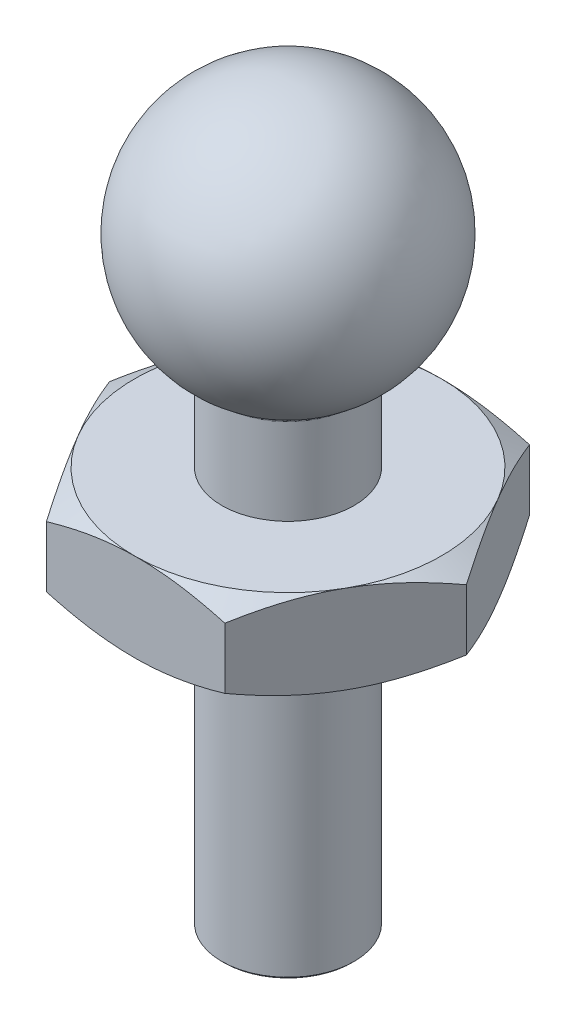
ISO-10303-21;
HEADER;
FILE_DESCRIPTION(('STEP AP214'),'2;1');
FILE_NAME('part.step','',(''),(''),'','','');
FILE_SCHEMA(('AUTOMOTIVE_DESIGN { 1 0 10303 214 1 1 1 1 }'));
ENDSEC;
DATA;
#1=APPLICATION_CONTEXT('core data for automotive mechanical design processes');
#2=APPLICATION_PROTOCOL_DEFINITION('international standard','automotive_design',2000,#1);
#3=PRODUCT_CONTEXT('',#1,'mechanical');
#4=PRODUCT('Part','Part','',(#3));
#5=PRODUCT_RELATED_PRODUCT_CATEGORY('part','',(#4));
#6=PRODUCT_DEFINITION_FORMATION('','',#4);
#7=PRODUCT_DEFINITION_CONTEXT('part definition',#1,'design');
#8=PRODUCT_DEFINITION('design','',#6,#7);
#9=PRODUCT_DEFINITION_SHAPE('','',#8);
#10=(LENGTH_UNIT() NAMED_UNIT(*) SI_UNIT(.MILLI.,.METRE.));
#11=(NAMED_UNIT(*) PLANE_ANGLE_UNIT() SI_UNIT($,.RADIAN.));
#12=(NAMED_UNIT(*) SI_UNIT($,.STERADIAN.) SOLID_ANGLE_UNIT());
#13=UNCERTAINTY_MEASURE_WITH_UNIT(LENGTH_MEASURE(1.E-05),#10,'distance_accuracy_value','');
#14=(GEOMETRIC_REPRESENTATION_CONTEXT(3) GLOBAL_UNCERTAINTY_ASSIGNED_CONTEXT((#13)) GLOBAL_UNIT_ASSIGNED_CONTEXT((#10,
#11,#12)) REPRESENTATION_CONTEXT('',''));
#15=CARTESIAN_POINT('',(0.,0.,0.));
#16=DIRECTION('',(0.,0.,1.));
#17=DIRECTION('',(1.,0.,0.));
#18=AXIS2_PLACEMENT_3D('',#15,#16,#17);
#19=CARTESIAN_POINT('',(2.03230647050247,9.,3.46410161513776));
#20=DIRECTION('',(0.0069662544333495,0.,0.999975735355198));
#21=DIRECTION('',(0.999975735355199,0.,-0.0069662544333495));
#22=AXIS2_PLACEMENT_3D('',#19,#20,#21);
#23=PLANE('',#22);
#24=DIRECTION('',(0.,-1.,0.));
#25=VECTOR('',#24,1.);
#26=CARTESIAN_POINT('',(2.03230647050247,9.,3.46410161513776));
#27=LINE('',#26,#25);
#28=CARTESIAN_POINT('',(2.03230647050247,8.68934192813876,3.46410161513776));
#29=VERTEX_POINT('',#28);
#30=CARTESIAN_POINT('',(2.03230647050247,7.31065807186124,3.46410161513776));
#31=VERTEX_POINT('',#30);
#32=EDGE_CURVE('E342',#29,#31,#27,.T.);
#33=ORIENTED_EDGE('',*,*,#32,.F.);
#34=CARTESIAN_POINT('',(2.03250647050247,8.68928418955454,3.46410022185306));
#35=CARTESIAN_POINT('',(1.85601748331803,8.74025194472752,3.46532971887578));
#36=CARTESIAN_POINT('',(1.67800505315194,8.78660517486892,3.46656982884745));
#37=CARTESIAN_POINT('',(1.31889775153608,8.86751500820949,3.46907152238208));
#38=CARTESIAN_POINT('',(1.13779649948355,8.90204298882506,3.47033315039503));
#39=CARTESIAN_POINT('',(0.777838393760421,8.95579055431224,3.47284077099137));
#40=CARTESIAN_POINT('',(0.599036922487538,8.97536786216779,3.47408637775752));
#41=CARTESIAN_POINT('',(0.240592702163102,8.99873864309493,3.47658345198708));
#42=CARTESIAN_POINT('',(0.0609512558694038,9.00255146967248,3.47783491037493));
#43=CARTESIAN_POINT('',(-0.274715876240262,8.99461743225737,3.48017330976255));
#44=CARTESIAN_POINT('',(-0.430791822340754,8.98481864294247,3.48126060089675));
#45=CARTESIAN_POINT('',(-0.741926885815265,8.95376286530669,3.48342809950563));
#46=CARTESIAN_POINT('',(-0.896984927116478,8.93249526933151,3.48450829948394));
#47=CARTESIAN_POINT('',(-1.2087614384966,8.87932817360267,3.48668026669057));
#48=CARTESIAN_POINT('',(-1.36544045034433,8.84720331090522,3.48777175903614));
#49=CARTESIAN_POINT('',(-1.67646170630289,8.7742926009489,3.48993846481367));
#50=CARTESIAN_POINT('',(-1.8308079347421,8.73352388407218,3.49101370600215));
#51=CARTESIAN_POINT('',(-1.98404676474877,8.68928418955454,3.4920812325842));
#52=B_SPLINE_CURVE_WITH_KNOTS('',3,(#34,#35,#36,#37,#38,#39,#40,#41,#42,#43,#44,#45,#46,#47,#48,
#49,#50,#51),.UNSPECIFIED.,.F.,.F.,(4,2,2,2,2,2,2,2,4),(0.,0.551332297066217,1.10398979547317,
1.6429693972962,2.1812871157581,2.6500021487578,3.11915144804698,3.59870696123175,
4.07732082967591),.UNSPECIFIED.);
#53=CARTESIAN_POINT('',(0.0242298528768522,9.,3.47809072721863));
#54=VERTEX_POINT('',#53);
#55=EDGE_CURVE('E415',#29,#54,#52,.T.);
#56=ORIENTED_EDGE('',*,*,#55,.T.);
#57=CARTESIAN_POINT('',(-1.98384676474877,8.68934192813876,3.49207983929951));
#58=VERTEX_POINT('',#57);
#59=EDGE_CURVE('E72',#54,#58,#52,.T.);
#60=ORIENTED_EDGE('',*,*,#59,.T.);
#61=DIRECTION('',(0.,-1.,0.));
#62=VECTOR('',#61,1.);
#63=CARTESIAN_POINT('',(-1.98384676474877,9.,3.49207983929951));
#64=LINE('',#63,#62);
#65=CARTESIAN_POINT('',(-1.98384676474877,7.31065807186124,3.49207983929951));
#66=VERTEX_POINT('',#65);
#67=EDGE_CURVE('E389',#58,#66,#64,.T.);
#68=ORIENTED_EDGE('',*,*,#67,.T.);
#69=CARTESIAN_POINT('',(-1.98404676474877,7.31071581044546,3.4920812325842));
#70=CARTESIAN_POINT('',(-1.80755777756433,7.25974805527248,3.49085173556148));
#71=CARTESIAN_POINT('',(-1.62954534739823,7.21339482513108,3.48961162558982));
#72=CARTESIAN_POINT('',(-1.27043804578238,7.13248499179051,3.48710993205518));
#73=CARTESIAN_POINT('',(-1.08933679372985,7.09795701117494,3.48584830404223));
#74=CARTESIAN_POINT('',(-0.729378688006716,7.04420944568776,3.4833406834459));
#75=CARTESIAN_POINT('',(-0.550577216733833,7.02463213783221,3.48209507667975));
#76=CARTESIAN_POINT('',(-0.192132996409398,7.00126135690507,3.47959800245018));
#77=CARTESIAN_POINT('',(-0.012491550115699,6.99744853032752,3.47834654406233));
#78=CARTESIAN_POINT('',(0.323175581993966,7.00538256774263,3.47600814467471));
#79=CARTESIAN_POINT('',(0.479251528094459,7.01518135705753,3.47492085354052));
#80=CARTESIAN_POINT('',(0.79038659156897,7.04623713469332,3.47275335493163));
#81=CARTESIAN_POINT('',(0.945444632870183,7.06750473066849,3.47167315495332));
#82=CARTESIAN_POINT('',(1.2572211442503,7.12067182639733,3.4695011877467));
#83=CARTESIAN_POINT('',(1.41390015609803,7.15279668909478,3.46840969540112));
#84=CARTESIAN_POINT('',(1.7249214120566,7.22570739905111,3.46624298962359));
#85=CARTESIAN_POINT('',(1.87926764049581,7.26647611592782,3.46516774843511));
#86=CARTESIAN_POINT('',(2.03250647050247,7.31071581044546,3.46410022185306));
#87=B_SPLINE_CURVE_WITH_KNOTS('',3,(#69,#70,#71,#72,#73,#74,#75,#76,#77,#78,#79,#80,#81,#82,#83,
#84,#85,#86),.UNSPECIFIED.,.F.,.F.,(4,2,2,2,2,2,2,2,4),(0.,0.551332297066217,1.10398979547317,
1.6429693972962,2.1812871157581,2.6500021487578,3.11915144804698,3.59870696123175,
4.07732082967591),.UNSPECIFIED.);
#88=CARTESIAN_POINT('',(0.0242298528768522,7.,3.47809072721863));
#89=VERTEX_POINT('',#88);
#90=EDGE_CURVE('E393',#66,#89,#87,.T.);
#91=ORIENTED_EDGE('',*,*,#90,.T.);
#92=EDGE_CURVE('E272',#89,#31,#87,.T.);
#93=ORIENTED_EDGE('',*,*,#92,.T.);
#94=EDGE_LOOP('',(#33,#56,#60,#68,#91,#93));
#95=FACE_BOUND('',#94,.T.);
#96=ADVANCED_FACE('F49',(#95),#23,.T.);
#97=CARTESIAN_POINT('',(4.01615323525124,9.,-0.0279782241617523));
#98=DIRECTION('',(0.869487517202301,0.,0.493954914369092));
#99=DIRECTION('',(0.493954914369093,0.,-0.869487517202302));
#100=AXIS2_PLACEMENT_3D('',#97,#98,#99);
#101=PLANE('',#100);
#102=DIRECTION('',(0.,-1.,0.));
#103=VECTOR('',#102,1.);
#104=CARTESIAN_POINT('',(4.01615323525124,9.,-0.0279782241617523));
#105=LINE('',#104,#103);
#106=CARTESIAN_POINT('',(4.01615323525124,8.68934192813876,-0.0279782241617523));
#107=VERTEX_POINT('',#106);
#108=CARTESIAN_POINT('',(4.01615323525124,7.31065807186124,-0.027978224161752));
#109=VERTEX_POINT('',#108);
#110=EDGE_CURVE('E406',#107,#109,#105,.T.);
#111=ORIENTED_EDGE('',*,*,#110,.F.);
#112=CARTESIAN_POINT('',(4.01626685503406,8.68927552407237,-0.0281782241617523));
#113=CARTESIAN_POINT('',(3.9290868868754,8.74024399092435,0.125280911194497));
#114=CARTESIAN_POINT('',(3.84115438670236,8.78659797699318,0.280064696177183));
#115=CARTESIAN_POINT('',(3.66376673763542,8.86750937925603,0.592312518970017));
#116=CARTESIAN_POINT('',(3.57430843677446,8.90203817187993,0.74978210505173));
#117=CARTESIAN_POINT('',(3.39650050450891,8.95578734264458,1.06276973422011));
#118=CARTESIAN_POINT('',(3.30817823127798,8.97536544866704,1.21823961989441));
#119=CARTESIAN_POINT('',(3.13111809078578,8.99873777230102,1.52991094347803));
#120=CARTESIAN_POINT('',(3.04238086710546,9.00255134407133,1.68611124851959));
#121=CARTESIAN_POINT('',(2.8765699084233,8.99461848445263,1.97798112286557));
#122=CARTESIAN_POINT('',(2.79947135422721,8.98481983937969,2.11369438032647));
#123=CARTESIAN_POINT('',(2.64577654324323,8.95376367118281,2.3842367227992));
#124=CARTESIAN_POINT('',(2.56918081806996,8.93249553885329,2.51906487203279));
#125=CARTESIAN_POINT('',(2.41516910839241,8.87932676878832,2.79016503759882));
#126=CARTESIAN_POINT('',(2.3377726168893,8.84720074656483,2.9264027412426));
#127=CARTESIAN_POINT('',(2.18413399600553,8.77428727696288,3.19684617470704));
#128=CARTESIAN_POINT('',(2.10788989822988,8.73351696215556,3.33105536940847));
#129=CARTESIAN_POINT('',(2.03219285071964,8.68927552407237,3.46430161513776));
#130=B_SPLINE_CURVE_WITH_KNOTS('',3,(#112,#113,#114,#115,#116,#117,#118,#119,#120,#121,#122,
#123,#124,#125,#126,#127,#128,#129),.UNSPECIFIED.,.F.,.F.,(4,2,2,2,2,2,2,2,4),(0.,
0.551334352338487,1.10399396230123,1.64297542301435,2.18129497793636,2.65002329393806,
3.11918592631203,3.59875547814022,4.07738328565858),.UNSPECIFIED.);
#131=CARTESIAN_POINT('',(3.02422985287685,9.,1.718061695488));
#132=VERTEX_POINT('',#131);
#133=EDGE_CURVE('E145',#107,#132,#130,.T.);
#134=ORIENTED_EDGE('',*,*,#133,.T.);
#135=EDGE_CURVE('E64',#132,#29,#130,.T.);
#136=ORIENTED_EDGE('',*,*,#135,.T.);
#137=ORIENTED_EDGE('',*,*,#32,.T.);
#138=CARTESIAN_POINT('',(2.03219285071964,7.31072447592763,3.46430161513776));
#139=CARTESIAN_POINT('',(2.11937281887831,7.25975600907565,3.31084247978151));
#140=CARTESIAN_POINT('',(2.20730531905135,7.21340202300682,3.15605869479882));
#141=CARTESIAN_POINT('',(2.38469296811829,7.13249062074397,2.84381087200599));
#142=CARTESIAN_POINT('',(2.47415126897925,7.09796182812007,2.68634128592427));
#143=CARTESIAN_POINT('',(2.6519592012448,7.04421265735542,2.3733536567559));
#144=CARTESIAN_POINT('',(2.74028147447572,7.02463455133296,2.2178837710816));
#145=CARTESIAN_POINT('',(2.91734161496792,7.00126222769899,1.90621244749797));
#146=CARTESIAN_POINT('',(3.00607883864824,6.99744865592868,1.75001214245642));
#147=CARTESIAN_POINT('',(3.17188979733041,7.00538151554737,1.45814226811043));
#148=CARTESIAN_POINT('',(3.2489883515265,7.01518016062031,1.32242901064954));
#149=CARTESIAN_POINT('',(3.40268316251048,7.04623632881719,1.0518866681768));
#150=CARTESIAN_POINT('',(3.47927888768375,7.06750446114671,0.917058518943212));
#151=CARTESIAN_POINT('',(3.6332905973613,7.12067323121169,0.645958353377186));
#152=CARTESIAN_POINT('',(3.71068708886441,7.15279925343517,0.509720649733405));
#153=CARTESIAN_POINT('',(3.86432570974817,7.22571272303712,0.239277216268965));
#154=CARTESIAN_POINT('',(3.94056980752383,7.26648303784444,0.105068021567539));
#155=CARTESIAN_POINT('',(4.01626685503406,7.31072447592763,-0.0281782241617522));
#156=B_SPLINE_CURVE_WITH_KNOTS('',3,(#138,#139,#140,#141,#142,#143,#144,#145,#146,#147,#148,
#149,#150,#151,#152,#153,#154,#155),.UNSPECIFIED.,.F.,.F.,(4,2,2,2,2,2,2,2,4),(0.,
0.551334352338486,1.10399396230123,1.64297542301435,2.18129497793635,2.65002329393806,
3.11918592631202,3.59875547814022,4.07738328565858),.UNSPECIFIED.);
#157=CARTESIAN_POINT('',(3.02422985287685,7.,1.718061695488));
#158=VERTEX_POINT('',#157);
#159=EDGE_CURVE('E271',#31,#158,#156,.T.);
#160=ORIENTED_EDGE('',*,*,#159,.T.);
#161=EDGE_CURVE('E264',#158,#109,#156,.T.);
#162=ORIENTED_EDGE('',*,*,#161,.T.);
#163=EDGE_LOOP('',(#111,#134,#136,#137,#160,#162));
#164=FACE_BOUND('',#163,.T.);
#165=ADVANCED_FACE('F278',(#164),#101,.T.);
#166=CARTESIAN_POINT('',(1.98384676474877,9.,-3.49207983929951));
#167=DIRECTION('',(0.862521262768952,0.,-0.506020820986106));
#168=DIRECTION('',(-0.506020820986106,0.,-0.862521262768952));
#169=AXIS2_PLACEMENT_3D('',#166,#167,#168);
#170=PLANE('',#169);
#171=DIRECTION('',(0.,-1.,0.));
#172=VECTOR('',#171,1.);
#173=CARTESIAN_POINT('',(1.98384676474877,9.,-3.49207983929951));
#174=LINE('',#173,#172);
#175=CARTESIAN_POINT('',(1.98384676474877,8.68934192813876,-3.49207983929951));
#176=VERTEX_POINT('',#175);
#177=CARTESIAN_POINT('',(1.98384676474877,7.31065807186124,-3.49207983929951));
#178=VERTEX_POINT('',#177);
#179=EDGE_CURVE('E171',#176,#178,#174,.T.);
#180=ORIENTED_EDGE('',*,*,#179,.F.);
#181=CARTESIAN_POINT('',(1.98372942947998,8.6892749877289,-3.49227983929951));
#182=CARTESIAN_POINT('',(2.07303897092758,8.74024349862941,-3.34005017745163));
#183=CARTESIAN_POINT('',(2.16311942669748,8.78659753148546,-3.18650647877527));
#184=CARTESIAN_POINT('',(2.34484018248356,8.86750903085492,-2.87676029986015));
#185=CARTESIAN_POINT('',(2.43648371147052,8.90203787373715,-2.72055231578472));
#186=CARTESIAN_POINT('',(2.61863501766835,8.95578714385864,-2.41007225622788));
#187=CARTESIAN_POINT('',(2.70911476835368,8.97536529928277,-2.25584795244518));
#188=CARTESIAN_POINT('',(2.89050001747252,8.99873771840097,-1.9466736504614));
#189=CARTESIAN_POINT('',(2.98140485660032,9.00255133629425,-1.79172477605831));
#190=CARTESIAN_POINT('',(3.15126626193074,8.99461854957516,-1.5021930656125));
#191=CARTESIAN_POINT('',(3.23024825309996,8.98481991343071,-1.36756689227338));
#192=CARTESIAN_POINT('',(3.38769766721966,8.95376372106143,-1.09919163604556));
#193=CARTESIAN_POINT('',(3.46616454556526,8.932495555535,-0.965443481445333));
#194=CARTESIAN_POINT('',(3.62393860213959,8.8793266818386,-0.696514866524953));
#195=CARTESIAN_POINT('',(3.70322581108577,8.84720058784712,-0.561368444193122));
#196=CARTESIAN_POINT('',(3.86061766425667,8.77428694743888,-0.293091301600526));
#197=CARTESIAN_POINT('',(3.93872432497569,8.73351653372877,-0.159957144190263));
#198=CARTESIAN_POINT('',(4.01627057052002,8.6892749877289,-0.0277782241617519));
#199=B_SPLINE_CURVE_WITH_KNOTS('',3,(#181,#182,#183,#184,#185,#186,#187,#188,#189,#190,#191,
#192,#193,#194,#195,#196,#197,#198),.UNSPECIFIED.,.F.,.F.,(4,2,2,2,2,2,2,2,4),(0.,
0.551334479547965,1.10399422020381,1.64297579597154,2.18129546455986,2.65002460269731,
3.11918806030695,3.59875848104145,4.07738715130318),.UNSPECIFIED.);
#200=CARTESIAN_POINT('',(3.,9.,-1.76002903173063));
#201=VERTEX_POINT('',#200);
#202=EDGE_CURVE('E149',#176,#201,#199,.T.);
#203=ORIENTED_EDGE('',*,*,#202,.T.);
#204=EDGE_CURVE('E138',#201,#107,#199,.T.);
#205=ORIENTED_EDGE('',*,*,#204,.T.);
#206=ORIENTED_EDGE('',*,*,#110,.T.);
#207=CARTESIAN_POINT('',(4.01627057052002,7.3107250122711,-0.0277782241617522));
#208=CARTESIAN_POINT('',(3.92696102907242,7.25975650137059,-0.180007886009625));
#209=CARTESIAN_POINT('',(3.83688057330252,7.21340246851454,-0.333551584685985));
#210=CARTESIAN_POINT('',(3.65515981751644,7.13249096914508,-0.643297763601108));
#211=CARTESIAN_POINT('',(3.56351628852948,7.09796212626285,-0.799505747676537));
#212=CARTESIAN_POINT('',(3.38136498233165,7.04421285614136,-1.10998580723338));
#213=CARTESIAN_POINT('',(3.29088523164632,7.02463470071723,-1.26421011101608));
#214=CARTESIAN_POINT('',(3.10949998252748,7.00126228159903,-1.57338441299986));
#215=CARTESIAN_POINT('',(3.01859514339968,6.99744866370575,-1.72833328740295));
#216=CARTESIAN_POINT('',(2.84873373806926,7.00538145042484,-2.01786499784876));
#217=CARTESIAN_POINT('',(2.76975174690004,7.01518008656929,-2.15249117118788));
#218=CARTESIAN_POINT('',(2.61230233278034,7.04623627893857,-2.4208664274157));
#219=CARTESIAN_POINT('',(2.53383545443474,7.067504444465,-2.55461458201593));
#220=CARTESIAN_POINT('',(2.37606139786042,7.1206733181614,-2.82354319693631));
#221=CARTESIAN_POINT('',(2.29677418891423,7.15279941215288,-2.95868961926814));
#222=CARTESIAN_POINT('',(2.13938233574333,7.22571305256112,-3.22696676186073));
#223=CARTESIAN_POINT('',(2.06127567502431,7.26648346627123,-3.360100919271));
#224=CARTESIAN_POINT('',(1.98372942947998,7.3107250122711,-3.49227983929951));
#225=B_SPLINE_CURVE_WITH_KNOTS('',3,(#207,#208,#209,#210,#211,#212,#213,#214,#215,#216,#217,
#218,#219,#220,#221,#222,#223,#224),.UNSPECIFIED.,.F.,.F.,(4,2,2,2,2,2,2,2,4),(0.,
0.551334479547965,1.10399422020381,1.64297579597154,2.18129546455986,2.65002460269731,
3.11918806030695,3.59875848104145,4.07738715130318),.UNSPECIFIED.);
#226=CARTESIAN_POINT('',(3.,7.,-1.76002903173063));
#227=VERTEX_POINT('',#226);
#228=EDGE_CURVE('E263',#109,#227,#225,.T.);
#229=ORIENTED_EDGE('',*,*,#228,.T.);
#230=EDGE_CURVE('E257',#227,#178,#225,.T.);
#231=ORIENTED_EDGE('',*,*,#230,.T.);
#232=EDGE_LOOP('',(#180,#203,#205,#206,#229,#231));
#233=FACE_BOUND('',#232,.T.);
#234=ADVANCED_FACE('F169',(#233),#170,.T.);
#235=CARTESIAN_POINT('',(-2.03230647050247,9.,-3.46410161513776));
#236=DIRECTION('',(-0.00696625443334983,0.,-0.999975735355198));
#237=DIRECTION('',(-0.999975735355199,0.,0.00696625443334983));
#238=AXIS2_PLACEMENT_3D('',#235,#236,#237);
#239=PLANE('',#238);
#240=DIRECTION('',(0.,-1.,0.));
#241=VECTOR('',#240,1.);
#242=CARTESIAN_POINT('',(-2.03230647050247,9.,-3.46410161513776));
#243=LINE('',#242,#241);
#244=CARTESIAN_POINT('',(-2.03230647050247,8.68934192813876,-3.46410161513776));
#245=VERTEX_POINT('',#244);
#246=CARTESIAN_POINT('',(-2.03230647050247,7.31065807186124,-3.46410161513776));
#247=VERTEX_POINT('',#246);
#248=EDGE_CURVE('E378',#245,#247,#243,.T.);
#249=ORIENTED_EDGE('',*,*,#248,.F.);
#250=CARTESIAN_POINT('',(-2.03250647050247,8.68928418955454,-3.46410022185306));
#251=CARTESIAN_POINT('',(-1.85601748331803,8.74025194472753,-3.46532971887578));
#252=CARTESIAN_POINT('',(-1.67800505315194,8.78660517486892,-3.46656982884744));
#253=CARTESIAN_POINT('',(-1.31889775153608,8.86751500820949,-3.46907152238208));
#254=CARTESIAN_POINT('',(-1.13779649948355,8.90204298882506,-3.47033315039503));
#255=CARTESIAN_POINT('',(-0.777838393760421,8.95579055431224,-3.47284077099137));
#256=CARTESIAN_POINT('',(-0.599036922487538,8.97536786216779,-3.47408637775752));
#257=CARTESIAN_POINT('',(-0.240592702163102,8.99873864309493,-3.47658345198708));
#258=CARTESIAN_POINT('',(-0.0609512558694041,9.00255146967248,-3.47783491037493));
#259=CARTESIAN_POINT('',(0.274715876240261,8.99461743225737,-3.48017330976255));
#260=CARTESIAN_POINT('',(0.430791822340754,8.98481864294247,-3.48126060089675));
#261=CARTESIAN_POINT('',(0.741926885815265,8.95376286530669,-3.48342809950563));
#262=CARTESIAN_POINT('',(0.896984927116478,8.93249526933151,-3.48450829948394));
#263=CARTESIAN_POINT('',(1.2087614384966,8.87932817360267,-3.48668026669057));
#264=CARTESIAN_POINT('',(1.36544045034433,8.84720331090522,-3.48777175903614));
#265=CARTESIAN_POINT('',(1.67646170630289,8.7742926009489,-3.48993846481367));
#266=CARTESIAN_POINT('',(1.8308079347421,8.73352388407218,-3.49101370600215));
#267=CARTESIAN_POINT('',(1.98404676474877,8.68928418955454,-3.4920812325842));
#268=B_SPLINE_CURVE_WITH_KNOTS('',3,(#250,#251,#252,#253,#254,#255,#256,#257,#258,#259,#260,
#261,#262,#263,#264,#265,#266,#267),.UNSPECIFIED.,.F.,.F.,(4,2,2,2,2,2,2,2,4),(0.,
0.551332297066216,1.10398979547317,1.6429693972962,2.1812871157581,2.6500021487578,
3.11915144804698,3.59870696123175,4.07732082967591),.UNSPECIFIED.);
#269=CARTESIAN_POINT('',(-0.0242298528768534,9.,-3.47809072721863));
#270=VERTEX_POINT('',#269);
#271=EDGE_CURVE('E228',#245,#270,#268,.T.);
#272=ORIENTED_EDGE('',*,*,#271,.T.);
#273=EDGE_CURVE('E150',#270,#176,#268,.T.);
#274=ORIENTED_EDGE('',*,*,#273,.T.);
#275=ORIENTED_EDGE('',*,*,#179,.T.);
#276=CARTESIAN_POINT('',(1.98404676474877,7.31071581044546,-3.4920812325842));
#277=CARTESIAN_POINT('',(1.80755777756433,7.25974805527248,-3.49085173556148));
#278=CARTESIAN_POINT('',(1.62954534739823,7.21339482513108,-3.48961162558982));
#279=CARTESIAN_POINT('',(1.27043804578238,7.13248499179051,-3.48710993205518));
#280=CARTESIAN_POINT('',(1.08933679372985,7.09795701117494,-3.48584830404223));
#281=CARTESIAN_POINT('',(0.729378688006715,7.04420944568776,-3.4833406834459));
#282=CARTESIAN_POINT('',(0.550577216733832,7.02463213783221,-3.48209507667975));
#283=CARTESIAN_POINT('',(0.192132996409397,7.00126135690507,-3.47959800245018));
#284=CARTESIAN_POINT('',(0.0124915501156984,6.99744853032752,-3.47834654406233));
#285=CARTESIAN_POINT('',(-0.323175581993967,7.00538256774263,-3.47600814467471));
#286=CARTESIAN_POINT('',(-0.479251528094459,7.01518135705753,-3.47492085354052));
#287=CARTESIAN_POINT('',(-0.79038659156897,7.04623713469331,-3.47275335493163));
#288=CARTESIAN_POINT('',(-0.945444632870183,7.06750473066849,-3.47167315495332));
#289=CARTESIAN_POINT('',(-1.2572211442503,7.12067182639733,-3.4695011877467));
#290=CARTESIAN_POINT('',(-1.41390015609804,7.15279668909478,-3.46840969540112));
#291=CARTESIAN_POINT('',(-1.7249214120566,7.22570739905111,-3.46624298962359));
#292=CARTESIAN_POINT('',(-1.87926764049581,7.26647611592782,-3.46516774843511));
#293=CARTESIAN_POINT('',(-2.03250647050247,7.31071581044546,-3.46410022185306));
#294=B_SPLINE_CURVE_WITH_KNOTS('',3,(#276,#277,#278,#279,#280,#281,#282,#283,#284,#285,#286,
#287,#288,#289,#290,#291,#292,#293),.UNSPECIFIED.,.F.,.F.,(4,2,2,2,2,2,2,2,4),(0.,
0.551332297066216,1.10398979547317,1.6429693972962,2.1812871157581,2.6500021487578,
3.11915144804698,3.59870696123175,4.07732082967591),.UNSPECIFIED.);
#295=CARTESIAN_POINT('',(-0.0242298528768534,7.,-3.47809072721863));
#296=VERTEX_POINT('',#295);
#297=EDGE_CURVE('E250',#178,#296,#294,.T.);
#298=ORIENTED_EDGE('',*,*,#297,.T.);
#299=EDGE_CURVE('E242',#296,#247,#294,.T.);
#300=ORIENTED_EDGE('',*,*,#299,.T.);
#301=EDGE_LOOP('',(#249,#272,#274,#275,#298,#300));
#302=FACE_BOUND('',#301,.T.);
#303=ADVANCED_FACE('F234',(#302),#239,.T.);
#304=CARTESIAN_POINT('',(-4.01615323525124,9.,0.0279782241617515));
#305=DIRECTION('',(-0.869487517202301,0.,-0.493954914369093));
#306=DIRECTION('',(-0.493954914369093,0.,0.869487517202301));
#307=AXIS2_PLACEMENT_3D('',#304,#305,#306);
#308=PLANE('',#307);
#309=DIRECTION('',(0.,-1.,0.));
#310=VECTOR('',#309,1.);
#311=CARTESIAN_POINT('',(-4.01615323525124,9.,0.0279782241617515));
#312=LINE('',#311,#310);
#313=CARTESIAN_POINT('',(-4.01615323525124,8.68934192813876,0.0279782241617515));
#314=VERTEX_POINT('',#313);
#315=CARTESIAN_POINT('',(-4.01615323525124,7.31065807186124,0.0279782241617513));
#316=VERTEX_POINT('',#315);
#317=EDGE_CURVE('E395',#314,#316,#312,.T.);
#318=ORIENTED_EDGE('',*,*,#317,.F.);
#319=CARTESIAN_POINT('',(-4.01626685503406,8.68927552407237,0.0281782241617515));
#320=CARTESIAN_POINT('',(-3.9290868868754,8.74024399092435,-0.125280911194497));
#321=CARTESIAN_POINT('',(-3.84115438670236,8.78659797699318,-0.280064696177184));
#322=CARTESIAN_POINT('',(-3.66376673763542,8.86750937925603,-0.592312518970018));
#323=CARTESIAN_POINT('',(-3.57430843677446,8.90203817187993,-0.749782105051731));
#324=CARTESIAN_POINT('',(-3.39650050450891,8.95578734264458,-1.06276973422011));
#325=CARTESIAN_POINT('',(-3.30817823127798,8.97536544866704,-1.21823961989441));
#326=CARTESIAN_POINT('',(-3.13111809078578,8.99873777230102,-1.52991094347803));
#327=CARTESIAN_POINT('',(-3.04238086710546,9.00255134407133,-1.68611124851959));
#328=CARTESIAN_POINT('',(-2.8765699084233,8.99461848445263,-1.97798112286557));
#329=CARTESIAN_POINT('',(-2.79947135422721,8.98481983937969,-2.11369438032647));
#330=CARTESIAN_POINT('',(-2.64577654324323,8.95376367118281,-2.3842367227992));
#331=CARTESIAN_POINT('',(-2.56918081806996,8.93249553885329,-2.51906487203279));
#332=CARTESIAN_POINT('',(-2.41516910839241,8.87932676878832,-2.79016503759882));
#333=CARTESIAN_POINT('',(-2.3377726168893,8.84720074656483,-2.9264027412426));
#334=CARTESIAN_POINT('',(-2.18413399600553,8.77428727696288,-3.19684617470704));
#335=CARTESIAN_POINT('',(-2.10788989822987,8.73351696215556,-3.33105536940846));
#336=CARTESIAN_POINT('',(-2.03219285071964,8.68927552407238,-3.46430161513776));
#337=B_SPLINE_CURVE_WITH_KNOTS('',3,(#319,#320,#321,#322,#323,#324,#325,#326,#327,#328,#329,
#330,#331,#332,#333,#334,#335,#336),.UNSPECIFIED.,.F.,.F.,(4,2,2,2,2,2,2,2,4),(0.,
0.551334352338486,1.10399396230123,1.64297542301435,2.18129497793636,2.65002329393806,
3.11918592631202,3.59875547814022,4.07738328565858),.UNSPECIFIED.);
#338=CARTESIAN_POINT('',(-3.02422985287685,9.,-1.718061695488));
#339=VERTEX_POINT('',#338);
#340=EDGE_CURVE('E215',#314,#339,#337,.T.);
#341=ORIENTED_EDGE('',*,*,#340,.T.);
#342=EDGE_CURVE('E233',#339,#245,#337,.T.);
#343=ORIENTED_EDGE('',*,*,#342,.T.);
#344=ORIENTED_EDGE('',*,*,#248,.T.);
#345=CARTESIAN_POINT('',(-2.03219285071964,7.31072447592763,-3.46430161513776));
#346=CARTESIAN_POINT('',(-2.11937281887831,7.25975600907565,-3.31084247978151));
#347=CARTESIAN_POINT('',(-2.20730531905135,7.21340202300682,-3.15605869479882));
#348=CARTESIAN_POINT('',(-2.38469296811829,7.13249062074397,-2.84381087200599));
#349=CARTESIAN_POINT('',(-2.47415126897925,7.09796182812007,-2.68634128592427));
#350=CARTESIAN_POINT('',(-2.6519592012448,7.04421265735542,-2.3733536567559));
#351=CARTESIAN_POINT('',(-2.74028147447572,7.02463455133296,-2.2178837710816));
#352=CARTESIAN_POINT('',(-2.91734161496792,7.00126222769899,-1.90621244749797));
#353=CARTESIAN_POINT('',(-3.00607883864824,6.99744865592867,-1.75001214245642));
#354=CARTESIAN_POINT('',(-3.17188979733041,7.00538151554737,-1.45814226811043));
#355=CARTESIAN_POINT('',(-3.2489883515265,7.01518016062031,-1.32242901064954));
#356=CARTESIAN_POINT('',(-3.40268316251048,7.04623632881719,-1.0518866681768));
#357=CARTESIAN_POINT('',(-3.47927888768375,7.06750446114671,-0.917058518943212));
#358=CARTESIAN_POINT('',(-3.6332905973613,7.12067323121169,-0.645958353377187));
#359=CARTESIAN_POINT('',(-3.71068708886441,7.15279925343517,-0.509720649733405));
#360=CARTESIAN_POINT('',(-3.86432570974817,7.22571272303712,-0.239277216268965));
#361=CARTESIAN_POINT('',(-3.94056980752383,7.26648303784444,-0.105068021567539));
#362=CARTESIAN_POINT('',(-4.01626685503406,7.31072447592763,0.0281782241617515));
#363=B_SPLINE_CURVE_WITH_KNOTS('',3,(#345,#346,#347,#348,#349,#350,#351,#352,#353,#354,#355,
#356,#357,#358,#359,#360,#361,#362),.UNSPECIFIED.,.F.,.F.,(4,2,2,2,2,2,2,2,4),(0.,
0.551334352338486,1.10399396230123,1.64297542301435,2.18129497793635,2.65002329393806,
3.11918592631202,3.59875547814022,4.07738328565858),.UNSPECIFIED.);
#364=CARTESIAN_POINT('',(-3.02422985287685,7.,-1.718061695488));
#365=VERTEX_POINT('',#364);
#366=EDGE_CURVE('E251',#247,#365,#363,.T.);
#367=ORIENTED_EDGE('',*,*,#366,.T.);
#368=EDGE_CURVE('E252',#365,#316,#363,.T.);
#369=ORIENTED_EDGE('',*,*,#368,.T.);
#370=EDGE_LOOP('',(#318,#341,#343,#344,#367,#369));
#371=FACE_BOUND('',#370,.T.);
#372=ADVANCED_FACE('F237',(#371),#308,.T.);
#373=CARTESIAN_POINT('',(-1.98384676474877,9.,3.49207983929951));
#374=DIRECTION('',(-0.862521262768952,0.,0.506020820986106));
#375=DIRECTION('',(0.506020820986106,0.,0.862521262768952));
#376=AXIS2_PLACEMENT_3D('',#373,#374,#375);
#377=PLANE('',#376);
#378=ORIENTED_EDGE('',*,*,#67,.F.);
#379=CARTESIAN_POINT('',(-1.98372942947998,8.6892749877289,3.49227983929951));
#380=CARTESIAN_POINT('',(-2.07303897092758,8.74024349862941,3.34005017745163));
#381=CARTESIAN_POINT('',(-2.16311942669748,8.78659753148546,3.18650647877527));
#382=CARTESIAN_POINT('',(-2.34484018248356,8.86750903085492,2.87676029986015));
#383=CARTESIAN_POINT('',(-2.43648371147052,8.90203787373715,2.72055231578472));
#384=CARTESIAN_POINT('',(-2.61863501766835,8.95578714385864,2.41007225622788));
#385=CARTESIAN_POINT('',(-2.70911476835368,8.97536529928277,2.25584795244518));
#386=CARTESIAN_POINT('',(-2.89050001747252,8.99873771840097,1.9466736504614));
#387=CARTESIAN_POINT('',(-2.98140485660032,9.00255133629425,1.79172477605831));
#388=CARTESIAN_POINT('',(-3.15126626193074,8.99461854957516,1.5021930656125));
#389=CARTESIAN_POINT('',(-3.23024825309996,8.98481991343071,1.36756689227338));
#390=CARTESIAN_POINT('',(-3.38769766721966,8.95376372106143,1.09919163604556));
#391=CARTESIAN_POINT('',(-3.46616454556526,8.932495555535,0.965443481445332));
#392=CARTESIAN_POINT('',(-3.62393860213959,8.8793266818386,0.696514866524953));
#393=CARTESIAN_POINT('',(-3.70322581108577,8.84720058784712,0.561368444193122));
#394=CARTESIAN_POINT('',(-3.86061766425667,8.77428694743888,0.293091301600525));
#395=CARTESIAN_POINT('',(-3.93872432497569,8.73351653372877,0.159957144190262));
#396=CARTESIAN_POINT('',(-4.01627057052002,8.6892749877289,0.0277782241617509));
#397=B_SPLINE_CURVE_WITH_KNOTS('',3,(#379,#380,#381,#382,#383,#384,#385,#386,#387,#388,#389,
#390,#391,#392,#393,#394,#395,#396),.UNSPECIFIED.,.F.,.F.,(4,2,2,2,2,2,2,2,4),(0.,
0.551334479547965,1.10399422020381,1.64297579597154,2.18129546455986,2.65002460269731,
3.11918806030695,3.59875848104145,4.07738715130318),.UNSPECIFIED.);
#398=CARTESIAN_POINT('',(-3.,9.,1.76002903173063));
#399=VERTEX_POINT('',#398);
#400=EDGE_CURVE('E416',#58,#399,#397,.T.);
#401=ORIENTED_EDGE('',*,*,#400,.T.);
#402=EDGE_CURVE('E205',#399,#314,#397,.T.);
#403=ORIENTED_EDGE('',*,*,#402,.T.);
#404=ORIENTED_EDGE('',*,*,#317,.T.);
#405=CARTESIAN_POINT('',(-4.01627057052002,7.3107250122711,0.0277782241617515));
#406=CARTESIAN_POINT('',(-3.92696102907242,7.2597565013706,0.180007886009624));
#407=CARTESIAN_POINT('',(-3.83688057330252,7.21340246851454,0.333551584685984));
#408=CARTESIAN_POINT('',(-3.65515981751644,7.13249096914508,0.643297763601108));
#409=CARTESIAN_POINT('',(-3.56351628852948,7.09796212626285,0.799505747676536));
#410=CARTESIAN_POINT('',(-3.38136498233165,7.04421285614136,1.10998580723338));
#411=CARTESIAN_POINT('',(-3.29088523164632,7.02463470071723,1.26421011101608));
#412=CARTESIAN_POINT('',(-3.10949998252748,7.00126228159903,1.57338441299986));
#413=CARTESIAN_POINT('',(-3.01859514339968,6.99744866370575,1.72833328740295));
#414=CARTESIAN_POINT('',(-2.84873373806926,7.00538145042484,2.01786499784876));
#415=CARTESIAN_POINT('',(-2.76975174690004,7.01518008656929,2.15249117118788));
#416=CARTESIAN_POINT('',(-2.61230233278034,7.04623627893857,2.4208664274157));
#417=CARTESIAN_POINT('',(-2.53383545443474,7.067504444465,2.55461458201593));
#418=CARTESIAN_POINT('',(-2.37606139786042,7.1206733181614,2.82354319693631));
#419=CARTESIAN_POINT('',(-2.29677418891423,7.15279941215288,2.95868961926814));
#420=CARTESIAN_POINT('',(-2.13938233574333,7.22571305256112,3.22696676186073));
#421=CARTESIAN_POINT('',(-2.06127567502431,7.26648346627123,3.360100919271));
#422=CARTESIAN_POINT('',(-1.98372942947998,7.3107250122711,3.49227983929951));
#423=B_SPLINE_CURVE_WITH_KNOTS('',3,(#405,#406,#407,#408,#409,#410,#411,#412,#413,#414,#415,
#416,#417,#418,#419,#420,#421,#422),.UNSPECIFIED.,.F.,.F.,(4,2,2,2,2,2,2,2,4),(0.,
0.551334479547965,1.10399422020381,1.64297579597154,2.18129546455986,2.65002460269731,
3.11918806030695,3.59875848104145,4.07738715130318),.UNSPECIFIED.);
#424=CARTESIAN_POINT('',(-3.,7.,1.76002903173063));
#425=VERTEX_POINT('',#424);
#426=EDGE_CURVE('E380',#316,#425,#423,.T.);
#427=ORIENTED_EDGE('',*,*,#426,.T.);
#428=EDGE_CURVE('E174',#425,#66,#423,.T.);
#429=ORIENTED_EDGE('',*,*,#428,.T.);
#430=EDGE_LOOP('',(#378,#401,#403,#404,#427,#429));
#431=FACE_BOUND('',#430,.T.);
#432=ADVANCED_FACE('F308',(#431),#377,.T.);
#433=CARTESIAN_POINT('',(0.,7.,0.));
#434=DIRECTION('',(0.,1.,0.));
#435=DIRECTION('',(0.,0.,-1.));
#436=AXIS2_PLACEMENT_3D('',#433,#434,#435);
#437=CONICAL_SURFACE('',#436,3.47817512390257,1.0471975511966);
#438=CARTESIAN_POINT('',(0.,7.,0.));
#439=DIRECTION('',(0.,-1.,0.));
#440=DIRECTION('',(0.,0.,-1.));
#441=AXIS2_PLACEMENT_3D('',#438,#439,#440);
#442=CIRCLE('',#441,3.47817512390257);
#443=EDGE_CURVE('E347',#296,#227,#442,.T.);
#444=ORIENTED_EDGE('',*,*,#443,.F.);
#445=ORIENTED_EDGE('',*,*,#297,.F.);
#446=ORIENTED_EDGE('',*,*,#230,.F.);
#447=EDGE_LOOP('',(#444,#445,#446));
#448=FACE_BOUND('',#447,.T.);
#449=ADVANCED_FACE('F405',(#448),#437,.T.);
#450=EDGE_CURVE('E349',#365,#296,#442,.T.);
#451=ORIENTED_EDGE('',*,*,#450,.F.);
#452=ORIENTED_EDGE('',*,*,#366,.F.);
#453=ORIENTED_EDGE('',*,*,#299,.F.);
#454=EDGE_LOOP('',(#451,#452,#453));
#455=FACE_BOUND('',#454,.T.);
#456=ADVANCED_FACE('F413',(#455),#437,.T.);
#457=EDGE_CURVE('E357',#425,#365,#442,.T.);
#458=ORIENTED_EDGE('',*,*,#457,.F.);
#459=ORIENTED_EDGE('',*,*,#426,.F.);
#460=ORIENTED_EDGE('',*,*,#368,.F.);
#461=EDGE_LOOP('',(#458,#459,#460));
#462=FACE_BOUND('',#461,.T.);
#463=ADVANCED_FACE('F199',(#462),#437,.T.);
#464=ORIENTED_EDGE('',*,*,#428,.F.);
#465=EDGE_CURVE('E359',#89,#425,#442,.T.);
#466=ORIENTED_EDGE('',*,*,#465,.F.);
#467=ORIENTED_EDGE('',*,*,#90,.F.);
#468=EDGE_LOOP('',(#464,#466,#467));
#469=FACE_BOUND('',#468,.T.);
#470=ADVANCED_FACE('F392',(#469),#437,.T.);
#471=EDGE_CURVE('E162',#158,#89,#442,.T.);
#472=ORIENTED_EDGE('',*,*,#471,.F.);
#473=ORIENTED_EDGE('',*,*,#159,.F.);
#474=ORIENTED_EDGE('',*,*,#92,.F.);
#475=EDGE_LOOP('',(#472,#473,#474));
#476=FACE_BOUND('',#475,.T.);
#477=ADVANCED_FACE('F399',(#476),#437,.T.);
#478=CARTESIAN_POINT('',(0.,7.,0.));
#479=DIRECTION('',(0.,-1.,0.));
#480=DIRECTION('',(0.,0.,-1.));
#481=AXIS2_PLACEMENT_3D('',#478,#479,#480);
#482=CIRCLE('',#481,3.47817512390257);
#483=EDGE_CURVE('E172',#227,#158,#482,.T.);
#484=ORIENTED_EDGE('',*,*,#483,.F.);
#485=ORIENTED_EDGE('',*,*,#228,.F.);
#486=ORIENTED_EDGE('',*,*,#161,.F.);
#487=EDGE_LOOP('',(#484,#485,#486));
#488=FACE_BOUND('',#487,.T.);
#489=ADVANCED_FACE('F316',(#488),#437,.T.);
#490=CARTESIAN_POINT('',(0.,0.,0.));
#491=DIRECTION('',(0.,1.,0.));
#492=DIRECTION('',(0.,0.,1.));
#493=AXIS2_PLACEMENT_3D('',#490,#491,#492);
#494=PLANE('',#493);
#495=CARTESIAN_POINT('',(0.,0.,0.));
#496=DIRECTION('',(0.,1.,0.));
#497=DIRECTION('',(0.,0.,1.));
#498=AXIS2_PLACEMENT_3D('',#495,#496,#497);
#499=CIRCLE('',#498,1.45);
#500=CARTESIAN_POINT('',(0.,0.,1.45));
#501=VERTEX_POINT('',#500);
#502=EDGE_CURVE('E332',#501,#501,#499,.F.);
#503=ORIENTED_EDGE('',*,*,#502,.T.);
#504=EDGE_LOOP('',(#503));
#505=FACE_BOUND('',#504,.T.);
#506=ADVANCED_FACE('F312',(#505),#494,.F.);
#507=CARTESIAN_POINT('',(0.,0.0500000000000014,0.));
#508=DIRECTION('',(0.,1.,0.));
#509=DIRECTION('',(0.,0.,1.));
#510=AXIS2_PLACEMENT_3D('',#507,#508,#509);
#511=CONICAL_SURFACE('',#510,1.5,0.785398163397435);
#512=ORIENTED_EDGE('',*,*,#502,.F.);
#513=EDGE_LOOP('',(#512));
#514=FACE_BOUND('',#513,.T.);
#515=CARTESIAN_POINT('',(0.,0.0500000000000014,0.));
#516=DIRECTION('',(0.,1.,0.));
#517=DIRECTION('',(0.,0.,1.));
#518=AXIS2_PLACEMENT_3D('',#515,#516,#517);
#519=CIRCLE('',#518,1.5);
#520=CARTESIAN_POINT('',(0.,0.0500000000000014,1.5));
#521=VERTEX_POINT('',#520);
#522=EDGE_CURVE('E335',#521,#521,#519,.T.);
#523=ORIENTED_EDGE('',*,*,#522,.F.);
#524=EDGE_LOOP('',(#523));
#525=FACE_BOUND('',#524,.T.);
#526=ADVANCED_FACE('F315',(#514,#525),#511,.T.);
#527=CARTESIAN_POINT('',(0.,16.5980762113533,0.));
#528=DIRECTION('',(0.,1.,0.));
#529=DIRECTION('',(0.,0.,1.));
#530=AXIS2_PLACEMENT_3D('',#527,#528,#529);
#531=CYLINDRICAL_SURFACE('',#530,1.5);
#532=ORIENTED_EDGE('',*,*,#522,.T.);
#533=EDGE_LOOP('',(#532));
#534=FACE_BOUND('',#533,.T.);
#535=CARTESIAN_POINT('',(0.,7.,0.));
#536=DIRECTION('',(0.,1.,0.));
#537=DIRECTION('',(0.,0.,1.));
#538=AXIS2_PLACEMENT_3D('',#535,#536,#537);
#539=CIRCLE('',#538,1.5);
#540=CARTESIAN_POINT('',(0.,7.,1.5));
#541=VERTEX_POINT('',#540);
#542=EDGE_CURVE('E336',#541,#541,#539,.T.);
#543=ORIENTED_EDGE('',*,*,#542,.F.);
#544=EDGE_LOOP('',(#543));
#545=FACE_BOUND('',#544,.T.);
#546=ADVANCED_FACE('F286',(#534,#545),#531,.T.);
#547=CARTESIAN_POINT('',(0.,7.,0.));
#548=DIRECTION('',(0.,-1.,0.));
#549=DIRECTION('',(0.,0.,-1.));
#550=AXIS2_PLACEMENT_3D('',#547,#548,#549);
#551=PLANE('',#550);
#552=ORIENTED_EDGE('',*,*,#542,.T.);
#553=EDGE_LOOP('',(#552));
#554=FACE_BOUND('',#553,.T.);
#555=ORIENTED_EDGE('',*,*,#443,.T.);
#556=ORIENTED_EDGE('',*,*,#483,.T.);
#557=ORIENTED_EDGE('',*,*,#471,.T.);
#558=ORIENTED_EDGE('',*,*,#465,.T.);
#559=ORIENTED_EDGE('',*,*,#457,.T.);
#560=ORIENTED_EDGE('',*,*,#450,.T.);
#561=EDGE_LOOP('',(#555,#556,#557,#558,#559,#560));
#562=FACE_BOUND('',#561,.T.);
#563=ADVANCED_FACE('F283',(#554,#562),#551,.T.);
#564=CARTESIAN_POINT('',(0.,9.,0.));
#565=DIRECTION('',(0.,-1.,0.));
#566=DIRECTION('',(0.,0.,1.));
#567=AXIS2_PLACEMENT_3D('',#564,#565,#566);
#568=CONICAL_SURFACE('',#567,3.47817512390257,1.0471975511966);
#569=ORIENTED_EDGE('',*,*,#273,.F.);
#570=CARTESIAN_POINT('',(0.,9.,0.));
#571=DIRECTION('',(0.,-1.,0.));
#572=DIRECTION('',(0.,0.,-1.));
#573=AXIS2_PLACEMENT_3D('',#570,#571,#572);
#574=CIRCLE('',#573,3.47817512390257);
#575=EDGE_CURVE('E155',#270,#201,#574,.T.);
#576=ORIENTED_EDGE('',*,*,#575,.T.);
#577=ORIENTED_EDGE('',*,*,#202,.F.);
#578=EDGE_LOOP('',(#569,#576,#577));
#579=FACE_BOUND('',#578,.T.);
#580=ADVANCED_FACE('F156',(#579),#568,.T.);
#581=ORIENTED_EDGE('',*,*,#342,.F.);
#582=EDGE_CURVE('E161',#339,#270,#574,.T.);
#583=ORIENTED_EDGE('',*,*,#582,.T.);
#584=ORIENTED_EDGE('',*,*,#271,.F.);
#585=EDGE_LOOP('',(#581,#583,#584));
#586=FACE_BOUND('',#585,.T.);
#587=ADVANCED_FACE('F197',(#586),#568,.T.);
#588=ORIENTED_EDGE('',*,*,#402,.F.);
#589=EDGE_CURVE('E418',#399,#339,#574,.T.);
#590=ORIENTED_EDGE('',*,*,#589,.T.);
#591=ORIENTED_EDGE('',*,*,#340,.F.);
#592=EDGE_LOOP('',(#588,#590,#591));
#593=FACE_BOUND('',#592,.T.);
#594=ADVANCED_FACE('F192',(#593),#568,.T.);
#595=EDGE_CURVE('E167',#54,#399,#574,.T.);
#596=ORIENTED_EDGE('',*,*,#595,.T.);
#597=ORIENTED_EDGE('',*,*,#400,.F.);
#598=ORIENTED_EDGE('',*,*,#59,.F.);
#599=EDGE_LOOP('',(#596,#597,#598));
#600=FACE_BOUND('',#599,.T.);
#601=ADVANCED_FACE('F196',(#600),#568,.T.);
#602=CARTESIAN_POINT('',(0.,9.,0.));
#603=DIRECTION('',(0.,1.,0.));
#604=DIRECTION('',(0.,0.,1.));
#605=AXIS2_PLACEMENT_3D('',#602,#603,#604);
#606=CIRCLE('',#605,3.47817512390257);
#607=EDGE_CURVE('E166',#54,#132,#606,.T.);
#608=ORIENTED_EDGE('',*,*,#607,.F.);
#609=ORIENTED_EDGE('',*,*,#55,.F.);
#610=ORIENTED_EDGE('',*,*,#135,.F.);
#611=EDGE_LOOP('',(#608,#609,#610));
#612=FACE_BOUND('',#611,.T.);
#613=ADVANCED_FACE('F422',(#612),#568,.T.);
#614=EDGE_CURVE('E142',#201,#132,#574,.T.);
#615=ORIENTED_EDGE('',*,*,#614,.T.);
#616=ORIENTED_EDGE('',*,*,#133,.F.);
#617=ORIENTED_EDGE('',*,*,#204,.F.);
#618=EDGE_LOOP('',(#615,#616,#617));
#619=FACE_BOUND('',#618,.T.);
#620=ADVANCED_FACE('F140',(#619),#568,.T.);
#621=CARTESIAN_POINT('',(0.,13.5980762113533,0.));
#622=DIRECTION('',(0.,1.,0.));
#623=DIRECTION('',(1.,0.,0.));
#624=AXIS2_PLACEMENT_3D('',#621,#622,#623);
#625=SPHERICAL_SURFACE('',#624,3.);
#626=CARTESIAN_POINT('',(0.,11.0214688657447,0.));
#627=DIRECTION('',(0.,1.,0.));
#628=DIRECTION('',(0.,0.,1.));
#629=AXIS2_PLACEMENT_3D('',#626,#627,#628);
#630=CIRCLE('',#629,1.53658536585366);
#631=CARTESIAN_POINT('',(0.,11.0214688657447,1.53658536585366));
#632=VERTEX_POINT('',#631);
#633=EDGE_CURVE('E57',#632,#632,#630,.T.);
#634=ORIENTED_EDGE('',*,*,#633,.T.);
#635=EDGE_LOOP('',(#634));
#636=FACE_BOUND('',#635,.T.);
#637=ADVANCED_FACE('F298',(#636),#625,.T.);
#638=CARTESIAN_POINT('',(0.,10.9570536821045,0.));
#639=DIRECTION('',(0.,1.,0.));
#640=DIRECTION('',(0.,0.,1.));
#641=AXIS2_PLACEMENT_3D('',#638,#639,#640);
#642=CIRCLE('',#641,1.5);
#643=CARTESIAN_POINT('',(0.,10.9570536821045,1.5));
#644=VERTEX_POINT('',#643);
#645=EDGE_CURVE('E12',#644,#644,#642,.F.);
#646=ORIENTED_EDGE('',*,*,#645,.T.);
#647=EDGE_LOOP('',(#646));
#648=FACE_BOUND('',#647,.T.);
#649=CARTESIAN_POINT('',(0.,9.,0.));
#650=DIRECTION('',(0.,-1.,0.));
#651=DIRECTION('',(0.,0.,-1.));
#652=AXIS2_PLACEMENT_3D('',#649,#650,#651);
#653=CIRCLE('',#652,1.5);
#654=CARTESIAN_POINT('',(0.,9.,-1.5));
#655=VERTEX_POINT('',#654);
#656=EDGE_CURVE('E338',#655,#655,#653,.T.);
#657=ORIENTED_EDGE('',*,*,#656,.F.);
#658=EDGE_LOOP('',(#657));
#659=FACE_BOUND('',#658,.T.);
#660=ADVANCED_FACE('F289',(#648,#659),#531,.T.);
#661=CARTESIAN_POINT('',(0.,9.,0.));
#662=DIRECTION('',(0.,-1.,0.));
#663=DIRECTION('',(0.,0.,-1.));
#664=AXIS2_PLACEMENT_3D('',#661,#662,#663);
#665=PLANE('',#664);
#666=ORIENTED_EDGE('',*,*,#656,.T.);
#667=EDGE_LOOP('',(#666));
#668=FACE_BOUND('',#667,.T.);
#669=ORIENTED_EDGE('',*,*,#614,.F.);
#670=ORIENTED_EDGE('',*,*,#575,.F.);
#671=ORIENTED_EDGE('',*,*,#582,.F.);
#672=ORIENTED_EDGE('',*,*,#589,.F.);
#673=ORIENTED_EDGE('',*,*,#595,.F.);
#674=ORIENTED_EDGE('',*,*,#607,.T.);
#675=EDGE_LOOP('',(#669,#670,#671,#672,#673,#674));
#676=FACE_BOUND('',#675,.T.);
#677=ADVANCED_FACE('F164',(#668,#676),#665,.F.);
#678=CARTESIAN_POINT('',(0.,10.9570536821045,0.));
#679=DIRECTION('',(0.,1.,0.));
#680=DIRECTION('',(0.,0.,1.));
#681=AXIS2_PLACEMENT_3D('',#678,#679,#680);
#682=TOROIDAL_SURFACE('',#681,1.575,0.075);
#683=ORIENTED_EDGE('',*,*,#645,.F.);
#684=EDGE_LOOP('',(#683));
#685=FACE_BOUND('',#684,.T.);
#686=ORIENTED_EDGE('',*,*,#633,.F.);
#687=EDGE_LOOP('',(#686));
#688=FACE_BOUND('',#687,.T.);
#689=ADVANCED_FACE('F51',(#685,#688),#682,.F.);
#690=CLOSED_SHELL('',(#96,#165,#234,#303,#372,#432,#449,#456,#463,#470,#477,#489,#506,#526,#546,
#563,#580,#587,#594,#601,#613,#620,#637,#660,#677,#689));
#691=MANIFOLD_SOLID_BREP('B2',#690);
#692=ADVANCED_BREP_SHAPE_REPRESENTATION('',(#18,#691),#14);
#693=SHAPE_DEFINITION_REPRESENTATION(#9,#692);
ENDSEC;
END-ISO-10303-21;
